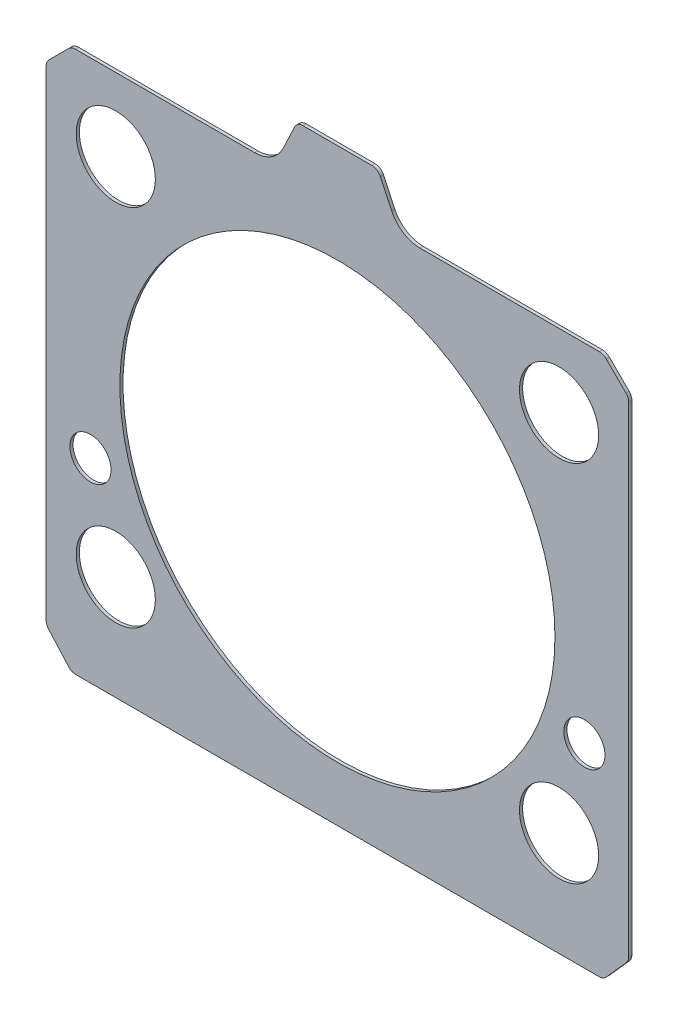
ISO-10303-21;
HEADER;
FILE_DESCRIPTION(('STEP AP214'),'2;1');
FILE_NAME('part.step','',(''),(''),'','','');
FILE_SCHEMA(('AUTOMOTIVE_DESIGN { 1 0 10303 214 1 1 1 1 }'));
ENDSEC;
DATA;
#1=APPLICATION_CONTEXT('core data for automotive mechanical design processes');
#2=APPLICATION_PROTOCOL_DEFINITION('international standard','automotive_design',2000,#1);
#3=PRODUCT_CONTEXT('',#1,'mechanical');
#4=PRODUCT('Part','Part','',(#3));
#5=PRODUCT_RELATED_PRODUCT_CATEGORY('part','',(#4));
#6=PRODUCT_DEFINITION_FORMATION('','',#4);
#7=PRODUCT_DEFINITION_CONTEXT('part definition',#1,'design');
#8=PRODUCT_DEFINITION('design','',#6,#7);
#9=PRODUCT_DEFINITION_SHAPE('','',#8);
#10=(LENGTH_UNIT() NAMED_UNIT(*) SI_UNIT(.MILLI.,.METRE.));
#11=(NAMED_UNIT(*) PLANE_ANGLE_UNIT() SI_UNIT($,.RADIAN.));
#12=(NAMED_UNIT(*) SI_UNIT($,.STERADIAN.) SOLID_ANGLE_UNIT());
#13=UNCERTAINTY_MEASURE_WITH_UNIT(LENGTH_MEASURE(1.E-05),#10,'distance_accuracy_value','');
#14=(GEOMETRIC_REPRESENTATION_CONTEXT(3) GLOBAL_UNCERTAINTY_ASSIGNED_CONTEXT((#13)) GLOBAL_UNIT_ASSIGNED_CONTEXT((#10,
#11,#12)) REPRESENTATION_CONTEXT('',''));
#15=CARTESIAN_POINT('',(0.,0.,0.));
#16=DIRECTION('',(0.,0.,1.));
#17=DIRECTION('',(1.,0.,0.));
#18=AXIS2_PLACEMENT_3D('',#15,#16,#17);
#19=CARTESIAN_POINT('',(92.,85.,1.));
#20=DIRECTION('',(0.,0.,1.));
#21=DIRECTION('',(1.,0.,0.));
#22=AXIS2_PLACEMENT_3D('',#19,#20,#21);
#23=PLANE('',#22);
#24=CARTESIAN_POINT('',(70.,-53.,1.));
#25=DIRECTION('',(0.,0.,1.));
#26=DIRECTION('',(1.,0.,0.));
#27=AXIS2_PLACEMENT_3D('',#24,#25,#26);
#28=CIRCLE('',#27,12.5);
#29=CARTESIAN_POINT('',(82.5,-53.,1.));
#30=VERTEX_POINT('',#29);
#31=EDGE_CURVE('E447',#30,#30,#28,.T.);
#32=ORIENTED_EDGE('',*,*,#31,.F.);
#33=EDGE_LOOP('',(#32));
#34=FACE_BOUND('',#33,.T.);
#35=CARTESIAN_POINT('',(70.,62.,1.));
#36=DIRECTION('',(0.,0.,1.));
#37=DIRECTION('',(1.,0.,0.));
#38=AXIS2_PLACEMENT_3D('',#35,#36,#37);
#39=CIRCLE('',#38,12.5);
#40=CARTESIAN_POINT('',(82.5,62.,1.));
#41=VERTEX_POINT('',#40);
#42=EDGE_CURVE('E435',#41,#41,#39,.T.);
#43=ORIENTED_EDGE('',*,*,#42,.F.);
#44=EDGE_LOOP('',(#43));
#45=FACE_BOUND('',#44,.T.);
#46=CARTESIAN_POINT('',(-78.,-24.5,1.));
#47=DIRECTION('',(0.,0.,1.));
#48=DIRECTION('',(-1.,0.,0.));
#49=AXIS2_PLACEMENT_3D('',#46,#47,#48);
#50=CIRCLE('',#49,6.5);
#51=CARTESIAN_POINT('',(-84.5,-24.5,1.));
#52=VERTEX_POINT('',#51);
#53=EDGE_CURVE('E423',#52,#52,#50,.T.);
#54=ORIENTED_EDGE('',*,*,#53,.F.);
#55=EDGE_LOOP('',(#54));
#56=FACE_BOUND('',#55,.T.);
#57=DIRECTION('',(0.66436383882992,-0.74740931868366,0.));
#58=VECTOR('',#57,1.);
#59=CARTESIAN_POINT('',(-92.,-77.,1.));
#60=LINE('',#59,#58);
#61=CARTESIAN_POINT('',(-91.242227956051,-77.8524935494427,1.));
#62=VERTEX_POINT('',#61);
#63=CARTESIAN_POINT('',(-84.8950297631203,-84.9930915164897,1.));
#64=VERTEX_POINT('',#63);
#65=EDGE_CURVE('E391',#62,#64,#60,.T.);
#66=ORIENTED_EDGE('',*,*,#65,.T.);
#67=CARTESIAN_POINT('',(-82.6528018070693,-83.,1.));
#68=DIRECTION('',(0.,0.,1.));
#69=DIRECTION('',(1.,0.,0.));
#70=AXIS2_PLACEMENT_3D('',#67,#68,#69);
#71=CIRCLE('',#70,3.);
#72=CARTESIAN_POINT('',(-82.6528018070693,-86.,1.));
#73=VERTEX_POINT('',#72);
#74=EDGE_CURVE('E320',#64,#73,#71,.T.);
#75=ORIENTED_EDGE('',*,*,#74,.T.);
#76=DIRECTION('',(1.,0.,0.));
#77=VECTOR('',#76,1.);
#78=CARTESIAN_POINT('',(-84.,-86.,1.));
#79=LINE('',#78,#77);
#80=CARTESIAN_POINT('',(82.6528018070693,-86.,1.));
#81=VERTEX_POINT('',#80);
#82=EDGE_CURVE('E393',#73,#81,#79,.T.);
#83=ORIENTED_EDGE('',*,*,#82,.T.);
#84=CARTESIAN_POINT('',(82.6528018070693,-83.,1.));
#85=DIRECTION('',(0.,0.,1.));
#86=DIRECTION('',(1.,0.,0.));
#87=AXIS2_PLACEMENT_3D('',#84,#85,#86);
#88=CIRCLE('',#87,3.);
#89=CARTESIAN_POINT('',(84.8950297631203,-84.9930915164897,1.));
#90=VERTEX_POINT('',#89);
#91=EDGE_CURVE('E63',#81,#90,#88,.T.);
#92=ORIENTED_EDGE('',*,*,#91,.T.);
#93=DIRECTION('',(0.66436383882992,0.74740931868366,0.));
#94=VECTOR('',#93,1.);
#95=CARTESIAN_POINT('',(92.,-77.,1.));
#96=LINE('',#95,#94);
#97=CARTESIAN_POINT('',(91.242227956051,-77.8524935494427,1.));
#98=VERTEX_POINT('',#97);
#99=EDGE_CURVE('E226',#90,#98,#96,.T.);
#100=ORIENTED_EDGE('',*,*,#99,.T.);
#101=CARTESIAN_POINT('',(89.,-75.8594020329529,1.));
#102=DIRECTION('',(0.,0.,1.));
#103=DIRECTION('',(1.,0.,0.));
#104=AXIS2_PLACEMENT_3D('',#101,#102,#103);
#105=CIRCLE('',#104,3.);
#106=CARTESIAN_POINT('',(92.,-75.8594020329529,1.));
#107=VERTEX_POINT('',#106);
#108=EDGE_CURVE('E315',#98,#107,#105,.T.);
#109=ORIENTED_EDGE('',*,*,#108,.T.);
#110=DIRECTION('',(0.,1.,0.));
#111=VECTOR('',#110,1.);
#112=CARTESIAN_POINT('',(92.,-77.,1.));
#113=LINE('',#112,#111);
#114=CARTESIAN_POINT('',(92.,75.7573593128807,1.));
#115=VERTEX_POINT('',#114);
#116=EDGE_CURVE('E260',#107,#115,#113,.T.);
#117=ORIENTED_EDGE('',*,*,#116,.T.);
#118=CARTESIAN_POINT('',(89.,75.7573593128807,1.));
#119=DIRECTION('',(0.,0.,1.));
#120=DIRECTION('',(1.,0.,0.));
#121=AXIS2_PLACEMENT_3D('',#118,#119,#120);
#122=CIRCLE('',#121,3.);
#123=CARTESIAN_POINT('',(91.1213203435597,77.8786796564404,1.));
#124=VERTEX_POINT('',#123);
#125=EDGE_CURVE('E313',#115,#124,#122,.T.);
#126=ORIENTED_EDGE('',*,*,#125,.T.);
#127=DIRECTION('',(-0.707106781186548,0.707106781186548,0.));
#128=VECTOR('',#127,1.);
#129=CARTESIAN_POINT('',(84.,85.,1.));
#130=LINE('',#129,#128);
#131=CARTESIAN_POINT('',(84.8786796564404,84.1213203435596,1.));
#132=VERTEX_POINT('',#131);
#133=EDGE_CURVE('E412',#124,#132,#130,.T.);
#134=ORIENTED_EDGE('',*,*,#133,.T.);
#135=CARTESIAN_POINT('',(82.7573593128808,82.,1.));
#136=DIRECTION('',(0.,0.,1.));
#137=DIRECTION('',(1.,0.,0.));
#138=AXIS2_PLACEMENT_3D('',#135,#136,#137);
#139=CIRCLE('',#138,3.);
#140=CARTESIAN_POINT('',(82.7573593128808,85.,1.));
#141=VERTEX_POINT('',#140);
#142=EDGE_CURVE('E311',#132,#141,#139,.T.);
#143=ORIENTED_EDGE('',*,*,#142,.T.);
#144=DIRECTION('',(-1.,0.,0.));
#145=VECTOR('',#144,1.);
#146=CARTESIAN_POINT('',(84.,85.,1.));
#147=LINE('',#146,#145);
#148=CARTESIAN_POINT('',(26.1494343746637,85.,1.));
#149=VERTEX_POINT('',#148);
#150=EDGE_CURVE('E362',#141,#149,#147,.T.);
#151=ORIENTED_EDGE('',*,*,#150,.T.);
#152=CARTESIAN_POINT('',(26.1494343746637,95.,1.));
#153=DIRECTION('',(0.,0.,1.));
#154=DIRECTION('',(1.,0.,0.));
#155=AXIS2_PLACEMENT_3D('',#152,#153,#154);
#156=CIRCLE('',#155,10.);
#157=CARTESIAN_POINT('',(17.0991973571654,90.7463886017758,1.));
#158=VERTEX_POINT('',#157);
#159=EDGE_CURVE('E215',#149,#158,#156,.F.);
#160=ORIENTED_EDGE('',*,*,#159,.T.);
#161=DIRECTION('',(-0.425361139822422,0.905023701749833,0.));
#162=VECTOR('',#161,1.);
#163=CARTESIAN_POINT('',(19.8,85.,1.));
#164=LINE('',#163,#162);
#165=CARTESIAN_POINT('',(13.5602407928504,98.2760834194673,1.));
#166=VERTEX_POINT('',#165);
#167=EDGE_CURVE('E225',#158,#166,#164,.T.);
#168=ORIENTED_EDGE('',*,*,#167,.T.);
#169=CARTESIAN_POINT('',(10.8451696876009,97.,1.));
#170=DIRECTION('',(0.,0.,1.));
#171=DIRECTION('',(1.,0.,0.));
#172=AXIS2_PLACEMENT_3D('',#169,#170,#171);
#173=CIRCLE('',#172,3.);
#174=CARTESIAN_POINT('',(10.8451696876009,100.,1.));
#175=VERTEX_POINT('',#174);
#176=EDGE_CURVE('E305',#166,#175,#173,.T.);
#177=ORIENTED_EDGE('',*,*,#176,.T.);
#178=DIRECTION('',(-1.,0.,0.));
#179=VECTOR('',#178,1.);
#180=CARTESIAN_POINT('',(12.75,100.,1.));
#181=LINE('',#180,#179);
#182=CARTESIAN_POINT('',(-10.8451696876009,100.,1.));
#183=VERTEX_POINT('',#182);
#184=EDGE_CURVE('E361',#175,#183,#181,.T.);
#185=ORIENTED_EDGE('',*,*,#184,.T.);
#186=CARTESIAN_POINT('',(-10.8451696876009,97.,1.));
#187=DIRECTION('',(0.,0.,1.));
#188=DIRECTION('',(1.,0.,0.));
#189=AXIS2_PLACEMENT_3D('',#186,#187,#188);
#190=CIRCLE('',#189,3.);
#191=CARTESIAN_POINT('',(-13.5602407928504,98.2760834194673,1.));
#192=VERTEX_POINT('',#191);
#193=EDGE_CURVE('E303',#183,#192,#190,.T.);
#194=ORIENTED_EDGE('',*,*,#193,.T.);
#195=DIRECTION('',(-0.425361139822422,-0.905023701749833,0.));
#196=VECTOR('',#195,1.);
#197=CARTESIAN_POINT('',(-12.75,100.,1.));
#198=LINE('',#197,#196);
#199=CARTESIAN_POINT('',(-17.0991973571654,90.7463886017758,1.));
#200=VERTEX_POINT('',#199);
#201=EDGE_CURVE('E376',#192,#200,#198,.T.);
#202=ORIENTED_EDGE('',*,*,#201,.T.);
#203=CARTESIAN_POINT('',(-26.1494343746637,95.,1.));
#204=DIRECTION('',(0.,0.,1.));
#205=DIRECTION('',(1.,0.,0.));
#206=AXIS2_PLACEMENT_3D('',#203,#204,#205);
#207=CIRCLE('',#206,10.);
#208=CARTESIAN_POINT('',(-26.1494343746637,85.,1.));
#209=VERTEX_POINT('',#208);
#210=EDGE_CURVE('E272',#200,#209,#207,.F.);
#211=ORIENTED_EDGE('',*,*,#210,.T.);
#212=DIRECTION('',(-1.,0.,0.));
#213=VECTOR('',#212,1.);
#214=CARTESIAN_POINT('',(-19.8,85.,1.));
#215=LINE('',#214,#213);
#216=CARTESIAN_POINT('',(-82.7573593128808,85.,1.));
#217=VERTEX_POINT('',#216);
#218=EDGE_CURVE('E379',#209,#217,#215,.T.);
#219=ORIENTED_EDGE('',*,*,#218,.T.);
#220=CARTESIAN_POINT('',(-82.7573593128808,82.,1.));
#221=DIRECTION('',(0.,0.,1.));
#222=DIRECTION('',(1.,0.,0.));
#223=AXIS2_PLACEMENT_3D('',#220,#221,#222);
#224=CIRCLE('',#223,3.);
#225=CARTESIAN_POINT('',(-84.8786796564404,84.1213203435596,1.));
#226=VERTEX_POINT('',#225);
#227=EDGE_CURVE('E309',#217,#226,#224,.T.);
#228=ORIENTED_EDGE('',*,*,#227,.T.);
#229=DIRECTION('',(-0.707106781186548,-0.707106781186548,0.));
#230=VECTOR('',#229,1.);
#231=CARTESIAN_POINT('',(-84.,85.,1.));
#232=LINE('',#231,#230);
#233=CARTESIAN_POINT('',(-91.1213203435597,77.8786796564404,1.));
#234=VERTEX_POINT('',#233);
#235=EDGE_CURVE('E382',#226,#234,#232,.T.);
#236=ORIENTED_EDGE('',*,*,#235,.T.);
#237=CARTESIAN_POINT('',(-89.,75.7573593128807,1.));
#238=DIRECTION('',(0.,0.,1.));
#239=DIRECTION('',(1.,0.,0.));
#240=AXIS2_PLACEMENT_3D('',#237,#238,#239);
#241=CIRCLE('',#240,3.);
#242=CARTESIAN_POINT('',(-92.,75.7573593128807,1.));
#243=VERTEX_POINT('',#242);
#244=EDGE_CURVE('E307',#234,#243,#241,.T.);
#245=ORIENTED_EDGE('',*,*,#244,.T.);
#246=DIRECTION('',(0.,-1.,0.));
#247=VECTOR('',#246,1.);
#248=CARTESIAN_POINT('',(-92.,77.,1.));
#249=LINE('',#248,#247);
#250=CARTESIAN_POINT('',(-92.,-75.8594020329529,1.));
#251=VERTEX_POINT('',#250);
#252=EDGE_CURVE('E388',#243,#251,#249,.T.);
#253=ORIENTED_EDGE('',*,*,#252,.T.);
#254=CARTESIAN_POINT('',(-89.,-75.8594020329529,1.));
#255=DIRECTION('',(0.,0.,1.));
#256=DIRECTION('',(1.,0.,0.));
#257=AXIS2_PLACEMENT_3D('',#254,#255,#256);
#258=CIRCLE('',#257,3.);
#259=EDGE_CURVE('E318',#251,#62,#258,.T.);
#260=ORIENTED_EDGE('',*,*,#259,.T.);
#261=EDGE_LOOP('',(#66,#75,#83,#92,#100,#109,#117,#126,#134,#143,#151,#160,#168,#177,#185,#194,
#202,#211,#219,#228,#236,#245,#253,#260));
#262=FACE_BOUND('',#261,.T.);
#263=CARTESIAN_POINT('',(0.,0.,1.));
#264=DIRECTION('',(0.,0.,1.));
#265=DIRECTION('',(1.,0.,0.));
#266=AXIS2_PLACEMENT_3D('',#263,#264,#265);
#267=CIRCLE('',#266,68.7);
#268=CARTESIAN_POINT('',(68.7,0.,1.));
#269=VERTEX_POINT('',#268);
#270=EDGE_CURVE('E398',#269,#269,#267,.T.);
#271=ORIENTED_EDGE('',*,*,#270,.F.);
#272=EDGE_LOOP('',(#271));
#273=FACE_BOUND('',#272,.T.);
#274=CARTESIAN_POINT('',(-70.,62.,1.));
#275=DIRECTION('',(0.,0.,1.));
#276=DIRECTION('',(1.,0.,0.));
#277=AXIS2_PLACEMENT_3D('',#274,#275,#276);
#278=CIRCLE('',#277,12.5);
#279=CARTESIAN_POINT('',(-57.5,62.,1.));
#280=VERTEX_POINT('',#279);
#281=EDGE_CURVE('E429',#280,#280,#278,.T.);
#282=ORIENTED_EDGE('',*,*,#281,.F.);
#283=EDGE_LOOP('',(#282));
#284=FACE_BOUND('',#283,.T.);
#285=CARTESIAN_POINT('',(-70.,-53.,1.));
#286=DIRECTION('',(0.,0.,1.));
#287=DIRECTION('',(1.,0.,0.));
#288=AXIS2_PLACEMENT_3D('',#285,#286,#287);
#289=CIRCLE('',#288,12.5);
#290=CARTESIAN_POINT('',(-57.5,-53.,1.));
#291=VERTEX_POINT('',#290);
#292=EDGE_CURVE('E441',#291,#291,#289,.T.);
#293=ORIENTED_EDGE('',*,*,#292,.F.);
#294=EDGE_LOOP('',(#293));
#295=FACE_BOUND('',#294,.T.);
#296=CARTESIAN_POINT('',(78.,-24.5,1.));
#297=DIRECTION('',(0.,0.,1.));
#298=DIRECTION('',(1.,0.,0.));
#299=AXIS2_PLACEMENT_3D('',#296,#297,#298);
#300=CIRCLE('',#299,6.5);
#301=CARTESIAN_POINT('',(84.5,-24.5,1.));
#302=VERTEX_POINT('',#301);
#303=EDGE_CURVE('E453',#302,#302,#300,.T.);
#304=ORIENTED_EDGE('',*,*,#303,.F.);
#305=EDGE_LOOP('',(#304));
#306=FACE_BOUND('',#305,.T.);
#307=ADVANCED_FACE('F41',(#34,#45,#56,#262,#273,#284,#295,#306),#23,.T.);
#308=CARTESIAN_POINT('',(92.,85.,0.));
#309=DIRECTION('',(0.,0.,1.));
#310=DIRECTION('',(1.,0.,0.));
#311=AXIS2_PLACEMENT_3D('',#308,#309,#310);
#312=PLANE('',#311);
#313=DIRECTION('',(1.,0.,0.));
#314=VECTOR('',#313,1.);
#315=CARTESIAN_POINT('',(-84.,-86.,0.));
#316=LINE('',#315,#314);
#317=CARTESIAN_POINT('',(-82.6528018070693,-86.,0.));
#318=VERTEX_POINT('',#317);
#319=CARTESIAN_POINT('',(82.6528018070693,-86.,0.));
#320=VERTEX_POINT('',#319);
#321=EDGE_CURVE('E256',#318,#320,#316,.T.);
#322=ORIENTED_EDGE('',*,*,#321,.F.);
#323=CARTESIAN_POINT('',(-82.6528018070693,-83.,0.));
#324=DIRECTION('',(0.,0.,1.));
#325=DIRECTION('',(1.,0.,0.));
#326=AXIS2_PLACEMENT_3D('',#323,#324,#325);
#327=CIRCLE('',#326,3.);
#328=CARTESIAN_POINT('',(-84.8950297631203,-84.9930915164897,0.));
#329=VERTEX_POINT('',#328);
#330=EDGE_CURVE('E296',#318,#329,#327,.F.);
#331=ORIENTED_EDGE('',*,*,#330,.T.);
#332=DIRECTION('',(0.66436383882992,-0.74740931868366,0.));
#333=VECTOR('',#332,1.);
#334=CARTESIAN_POINT('',(-92.,-77.,0.));
#335=LINE('',#334,#333);
#336=CARTESIAN_POINT('',(-91.242227956051,-77.8524935494427,0.));
#337=VERTEX_POINT('',#336);
#338=EDGE_CURVE('E253',#337,#329,#335,.T.);
#339=ORIENTED_EDGE('',*,*,#338,.F.);
#340=CARTESIAN_POINT('',(-89.,-75.8594020329529,0.));
#341=DIRECTION('',(0.,0.,1.));
#342=DIRECTION('',(1.,0.,0.));
#343=AXIS2_PLACEMENT_3D('',#340,#341,#342);
#344=CIRCLE('',#343,3.);
#345=CARTESIAN_POINT('',(-92.,-75.8594020329529,0.));
#346=VERTEX_POINT('',#345);
#347=EDGE_CURVE('E294',#337,#346,#344,.F.);
#348=ORIENTED_EDGE('',*,*,#347,.T.);
#349=DIRECTION('',(0.,-1.,0.));
#350=VECTOR('',#349,1.);
#351=CARTESIAN_POINT('',(-92.,77.,0.));
#352=LINE('',#351,#350);
#353=CARTESIAN_POINT('',(-92.,75.7573593128807,0.));
#354=VERTEX_POINT('',#353);
#355=EDGE_CURVE('E250',#354,#346,#352,.T.);
#356=ORIENTED_EDGE('',*,*,#355,.F.);
#357=CARTESIAN_POINT('',(-89.,75.7573593128807,0.));
#358=DIRECTION('',(0.,0.,1.));
#359=DIRECTION('',(1.,0.,0.));
#360=AXIS2_PLACEMENT_3D('',#357,#358,#359);
#361=CIRCLE('',#360,3.);
#362=CARTESIAN_POINT('',(-91.1213203435597,77.8786796564404,0.));
#363=VERTEX_POINT('',#362);
#364=EDGE_CURVE('E282',#354,#363,#361,.F.);
#365=ORIENTED_EDGE('',*,*,#364,.T.);
#366=DIRECTION('',(-0.707106781186548,-0.707106781186548,0.));
#367=VECTOR('',#366,1.);
#368=CARTESIAN_POINT('',(-84.,85.,0.));
#369=LINE('',#368,#367);
#370=CARTESIAN_POINT('',(-84.8786796564404,84.1213203435596,0.));
#371=VERTEX_POINT('',#370);
#372=EDGE_CURVE('E247',#371,#363,#369,.T.);
#373=ORIENTED_EDGE('',*,*,#372,.F.);
#374=CARTESIAN_POINT('',(-82.7573593128808,82.,0.));
#375=DIRECTION('',(0.,0.,1.));
#376=DIRECTION('',(1.,0.,0.));
#377=AXIS2_PLACEMENT_3D('',#374,#375,#376);
#378=CIRCLE('',#377,3.);
#379=CARTESIAN_POINT('',(-82.7573593128808,85.,0.));
#380=VERTEX_POINT('',#379);
#381=EDGE_CURVE('E284',#371,#380,#378,.F.);
#382=ORIENTED_EDGE('',*,*,#381,.T.);
#383=DIRECTION('',(-1.,0.,0.));
#384=VECTOR('',#383,1.);
#385=CARTESIAN_POINT('',(-19.8,85.,0.));
#386=LINE('',#385,#384);
#387=CARTESIAN_POINT('',(-26.1494343746637,85.,0.));
#388=VERTEX_POINT('',#387);
#389=EDGE_CURVE('E244',#388,#380,#386,.T.);
#390=ORIENTED_EDGE('',*,*,#389,.F.);
#391=CARTESIAN_POINT('',(-26.1494343746637,95.,0.));
#392=DIRECTION('',(0.,0.,1.));
#393=DIRECTION('',(1.,0.,0.));
#394=AXIS2_PLACEMENT_3D('',#391,#392,#393);
#395=CIRCLE('',#394,10.);
#396=CARTESIAN_POINT('',(-17.0991973571654,90.7463886017758,0.));
#397=VERTEX_POINT('',#396);
#398=EDGE_CURVE('E269',#388,#397,#395,.T.);
#399=ORIENTED_EDGE('',*,*,#398,.T.);
#400=DIRECTION('',(-0.425361139822422,-0.905023701749833,0.));
#401=VECTOR('',#400,1.);
#402=CARTESIAN_POINT('',(-12.75,100.,0.));
#403=LINE('',#402,#401);
#404=CARTESIAN_POINT('',(-13.5602407928504,98.2760834194673,0.));
#405=VERTEX_POINT('',#404);
#406=EDGE_CURVE('E237',#405,#397,#403,.T.);
#407=ORIENTED_EDGE('',*,*,#406,.F.);
#408=CARTESIAN_POINT('',(-10.8451696876009,97.,0.));
#409=DIRECTION('',(0.,0.,1.));
#410=DIRECTION('',(1.,0.,0.));
#411=AXIS2_PLACEMENT_3D('',#408,#409,#410);
#412=CIRCLE('',#411,3.);
#413=CARTESIAN_POINT('',(-10.8451696876009,100.,0.));
#414=VERTEX_POINT('',#413);
#415=EDGE_CURVE('E279',#405,#414,#412,.F.);
#416=ORIENTED_EDGE('',*,*,#415,.T.);
#417=DIRECTION('',(-1.,0.,0.));
#418=VECTOR('',#417,1.);
#419=CARTESIAN_POINT('',(12.75,100.,0.));
#420=LINE('',#419,#418);
#421=CARTESIAN_POINT('',(10.8451696876009,100.,0.));
#422=VERTEX_POINT('',#421);
#423=EDGE_CURVE('E233',#422,#414,#420,.T.);
#424=ORIENTED_EDGE('',*,*,#423,.F.);
#425=CARTESIAN_POINT('',(10.8451696876009,97.,0.));
#426=DIRECTION('',(0.,0.,1.));
#427=DIRECTION('',(1.,0.,0.));
#428=AXIS2_PLACEMENT_3D('',#425,#426,#427);
#429=CIRCLE('',#428,3.);
#430=CARTESIAN_POINT('',(13.5602407928504,98.2760834194673,0.));
#431=VERTEX_POINT('',#430);
#432=EDGE_CURVE('E232',#422,#431,#429,.F.);
#433=ORIENTED_EDGE('',*,*,#432,.T.);
#434=DIRECTION('',(-0.425361139822422,0.905023701749833,0.));
#435=VECTOR('',#434,1.);
#436=CARTESIAN_POINT('',(19.8,85.,0.));
#437=LINE('',#436,#435);
#438=CARTESIAN_POINT('',(17.0991973571654,90.7463886017758,0.));
#439=VERTEX_POINT('',#438);
#440=EDGE_CURVE('E222',#439,#431,#437,.T.);
#441=ORIENTED_EDGE('',*,*,#440,.F.);
#442=CARTESIAN_POINT('',(26.1494343746637,95.,0.));
#443=DIRECTION('',(0.,0.,1.));
#444=DIRECTION('',(1.,0.,0.));
#445=AXIS2_PLACEMENT_3D('',#442,#443,#444);
#446=CIRCLE('',#445,10.);
#447=CARTESIAN_POINT('',(26.1494343746637,85.,0.));
#448=VERTEX_POINT('',#447);
#449=EDGE_CURVE('E205',#439,#448,#446,.T.);
#450=ORIENTED_EDGE('',*,*,#449,.T.);
#451=DIRECTION('',(-1.,0.,0.));
#452=VECTOR('',#451,1.);
#453=CARTESIAN_POINT('',(84.,85.,0.));
#454=LINE('',#453,#452);
#455=CARTESIAN_POINT('',(82.7573593128808,85.,0.));
#456=VERTEX_POINT('',#455);
#457=EDGE_CURVE('E234',#456,#448,#454,.T.);
#458=ORIENTED_EDGE('',*,*,#457,.F.);
#459=CARTESIAN_POINT('',(82.7573593128808,82.,0.));
#460=DIRECTION('',(0.,0.,1.));
#461=DIRECTION('',(1.,0.,0.));
#462=AXIS2_PLACEMENT_3D('',#459,#460,#461);
#463=CIRCLE('',#462,3.);
#464=CARTESIAN_POINT('',(84.8786796564404,84.1213203435596,0.));
#465=VERTEX_POINT('',#464);
#466=EDGE_CURVE('E286',#456,#465,#463,.F.);
#467=ORIENTED_EDGE('',*,*,#466,.T.);
#468=DIRECTION('',(-0.707106781186548,0.707106781186548,0.));
#469=VECTOR('',#468,1.);
#470=CARTESIAN_POINT('',(84.,85.,0.));
#471=LINE('',#470,#469);
#472=CARTESIAN_POINT('',(91.1213203435597,77.8786796564404,0.));
#473=VERTEX_POINT('',#472);
#474=EDGE_CURVE('E239',#473,#465,#471,.T.);
#475=ORIENTED_EDGE('',*,*,#474,.F.);
#476=CARTESIAN_POINT('',(89.,75.7573593128807,0.));
#477=DIRECTION('',(0.,0.,1.));
#478=DIRECTION('',(1.,0.,0.));
#479=AXIS2_PLACEMENT_3D('',#476,#477,#478);
#480=CIRCLE('',#479,3.);
#481=CARTESIAN_POINT('',(92.,75.7573593128807,0.));
#482=VERTEX_POINT('',#481);
#483=EDGE_CURVE('E288',#473,#482,#480,.F.);
#484=ORIENTED_EDGE('',*,*,#483,.T.);
#485=DIRECTION('',(0.,1.,0.));
#486=VECTOR('',#485,1.);
#487=CARTESIAN_POINT('',(92.,-77.,0.));
#488=LINE('',#487,#486);
#489=CARTESIAN_POINT('',(92.,-75.8594020329529,0.));
#490=VERTEX_POINT('',#489);
#491=EDGE_CURVE('E396',#490,#482,#488,.T.);
#492=ORIENTED_EDGE('',*,*,#491,.F.);
#493=CARTESIAN_POINT('',(89.,-75.8594020329529,0.));
#494=DIRECTION('',(0.,0.,1.));
#495=DIRECTION('',(1.,0.,0.));
#496=AXIS2_PLACEMENT_3D('',#493,#494,#495);
#497=CIRCLE('',#496,3.);
#498=CARTESIAN_POINT('',(91.242227956051,-77.8524935494427,0.));
#499=VERTEX_POINT('',#498);
#500=EDGE_CURVE('E290',#490,#499,#497,.F.);
#501=ORIENTED_EDGE('',*,*,#500,.T.);
#502=DIRECTION('',(0.66436383882992,0.74740931868366,0.));
#503=VECTOR('',#502,1.);
#504=CARTESIAN_POINT('',(92.,-77.,0.));
#505=LINE('',#504,#503);
#506=CARTESIAN_POINT('',(84.8950297631203,-84.9930915164897,0.));
#507=VERTEX_POINT('',#506);
#508=EDGE_CURVE('E259',#507,#499,#505,.T.);
#509=ORIENTED_EDGE('',*,*,#508,.F.);
#510=CARTESIAN_POINT('',(82.6528018070693,-83.,0.));
#511=DIRECTION('',(0.,0.,1.));
#512=DIRECTION('',(1.,0.,0.));
#513=AXIS2_PLACEMENT_3D('',#510,#511,#512);
#514=CIRCLE('',#513,3.);
#515=EDGE_CURVE('E292',#507,#320,#514,.F.);
#516=ORIENTED_EDGE('',*,*,#515,.T.);
#517=EDGE_LOOP('',(#322,#331,#339,#348,#356,#365,#373,#382,#390,#399,#407,#416,#424,#433,#441,
#450,#458,#467,#475,#484,#492,#501,#509,#516));
#518=FACE_BOUND('',#517,.T.);
#519=CARTESIAN_POINT('',(0.,0.,0.));
#520=DIRECTION('',(0.,0.,1.));
#521=DIRECTION('',(1.,0.,0.));
#522=AXIS2_PLACEMENT_3D('',#519,#520,#521);
#523=CIRCLE('',#522,68.7);
#524=CARTESIAN_POINT('',(68.7,0.,0.));
#525=VERTEX_POINT('',#524);
#526=EDGE_CURVE('E420',#525,#525,#523,.T.);
#527=ORIENTED_EDGE('',*,*,#526,.T.);
#528=EDGE_LOOP('',(#527));
#529=FACE_BOUND('',#528,.T.);
#530=CARTESIAN_POINT('',(-78.,-24.5,0.));
#531=DIRECTION('',(0.,0.,1.));
#532=DIRECTION('',(-1.,0.,0.));
#533=AXIS2_PLACEMENT_3D('',#530,#531,#532);
#534=CIRCLE('',#533,6.5);
#535=CARTESIAN_POINT('',(-84.5,-24.5,0.));
#536=VERTEX_POINT('',#535);
#537=EDGE_CURVE('E426',#536,#536,#534,.T.);
#538=ORIENTED_EDGE('',*,*,#537,.T.);
#539=EDGE_LOOP('',(#538));
#540=FACE_BOUND('',#539,.T.);
#541=CARTESIAN_POINT('',(-70.,62.,0.));
#542=DIRECTION('',(0.,0.,1.));
#543=DIRECTION('',(1.,0.,0.));
#544=AXIS2_PLACEMENT_3D('',#541,#542,#543);
#545=CIRCLE('',#544,12.5);
#546=CARTESIAN_POINT('',(-57.5,62.,0.));
#547=VERTEX_POINT('',#546);
#548=EDGE_CURVE('E432',#547,#547,#545,.T.);
#549=ORIENTED_EDGE('',*,*,#548,.T.);
#550=EDGE_LOOP('',(#549));
#551=FACE_BOUND('',#550,.T.);
#552=CARTESIAN_POINT('',(70.,62.,0.));
#553=DIRECTION('',(0.,0.,1.));
#554=DIRECTION('',(1.,0.,0.));
#555=AXIS2_PLACEMENT_3D('',#552,#553,#554);
#556=CIRCLE('',#555,12.5);
#557=CARTESIAN_POINT('',(82.5,62.,0.));
#558=VERTEX_POINT('',#557);
#559=EDGE_CURVE('E438',#558,#558,#556,.T.);
#560=ORIENTED_EDGE('',*,*,#559,.T.);
#561=EDGE_LOOP('',(#560));
#562=FACE_BOUND('',#561,.T.);
#563=CARTESIAN_POINT('',(-70.,-53.,0.));
#564=DIRECTION('',(0.,0.,1.));
#565=DIRECTION('',(1.,0.,0.));
#566=AXIS2_PLACEMENT_3D('',#563,#564,#565);
#567=CIRCLE('',#566,12.5);
#568=CARTESIAN_POINT('',(-57.5,-53.,0.));
#569=VERTEX_POINT('',#568);
#570=EDGE_CURVE('E444',#569,#569,#567,.T.);
#571=ORIENTED_EDGE('',*,*,#570,.T.);
#572=EDGE_LOOP('',(#571));
#573=FACE_BOUND('',#572,.T.);
#574=CARTESIAN_POINT('',(70.,-53.,0.));
#575=DIRECTION('',(0.,0.,1.));
#576=DIRECTION('',(1.,0.,0.));
#577=AXIS2_PLACEMENT_3D('',#574,#575,#576);
#578=CIRCLE('',#577,12.5);
#579=CARTESIAN_POINT('',(82.5,-53.,0.));
#580=VERTEX_POINT('',#579);
#581=EDGE_CURVE('E450',#580,#580,#578,.T.);
#582=ORIENTED_EDGE('',*,*,#581,.T.);
#583=EDGE_LOOP('',(#582));
#584=FACE_BOUND('',#583,.T.);
#585=CARTESIAN_POINT('',(78.,-24.5,0.));
#586=DIRECTION('',(0.,0.,1.));
#587=DIRECTION('',(1.,0.,0.));
#588=AXIS2_PLACEMENT_3D('',#585,#586,#587);
#589=CIRCLE('',#588,6.5);
#590=CARTESIAN_POINT('',(84.5,-24.5,0.));
#591=VERTEX_POINT('',#590);
#592=EDGE_CURVE('E456',#591,#591,#589,.T.);
#593=ORIENTED_EDGE('',*,*,#592,.T.);
#594=EDGE_LOOP('',(#593));
#595=FACE_BOUND('',#594,.T.);
#596=ADVANCED_FACE('F229',(#518,#529,#540,#551,#562,#573,#584,#595),#312,.F.);
#597=CARTESIAN_POINT('',(92.,-77.,1.));
#598=DIRECTION('',(-1.,0.,0.));
#599=DIRECTION('',(0.,-1.,0.));
#600=AXIS2_PLACEMENT_3D('',#597,#598,#599);
#601=PLANE('',#600);
#602=ORIENTED_EDGE('',*,*,#116,.F.);
#603=DIRECTION('',(0.,0.,-1.));
#604=VECTOR('',#603,1.);
#605=CARTESIAN_POINT('',(92.,-75.8594020329529,1.));
#606=LINE('',#605,#604);
#607=EDGE_CURVE('E333',#107,#490,#606,.T.);
#608=ORIENTED_EDGE('',*,*,#607,.T.);
#609=ORIENTED_EDGE('',*,*,#491,.T.);
#610=DIRECTION('',(0.,0.,-1.));
#611=VECTOR('',#610,1.);
#612=CARTESIAN_POINT('',(92.,75.7573593128807,1.));
#613=LINE('',#612,#611);
#614=EDGE_CURVE('E331',#482,#115,#613,.F.);
#615=ORIENTED_EDGE('',*,*,#614,.T.);
#616=EDGE_LOOP('',(#602,#608,#609,#615));
#617=FACE_BOUND('',#616,.T.);
#618=ADVANCED_FACE('F472',(#617),#601,.F.);
#619=CARTESIAN_POINT('',(84.,85.,1.));
#620=DIRECTION('',(-0.707106781186548,-0.707106781186548,0.));
#621=DIRECTION('',(0.707106781186548,-0.707106781186548,0.));
#622=AXIS2_PLACEMENT_3D('',#619,#620,#621);
#623=PLANE('',#622);
#624=ORIENTED_EDGE('',*,*,#133,.F.);
#625=DIRECTION('',(0.,0.,-1.));
#626=VECTOR('',#625,1.);
#627=CARTESIAN_POINT('',(91.1213203435597,77.8786796564404,1.));
#628=LINE('',#627,#626);
#629=EDGE_CURVE('E338',#124,#473,#628,.T.);
#630=ORIENTED_EDGE('',*,*,#629,.T.);
#631=ORIENTED_EDGE('',*,*,#474,.T.);
#632=DIRECTION('',(0.,0.,-1.));
#633=VECTOR('',#632,1.);
#634=CARTESIAN_POINT('',(84.8786796564404,84.1213203435596,1.));
#635=LINE('',#634,#633);
#636=EDGE_CURVE('E336',#465,#132,#635,.F.);
#637=ORIENTED_EDGE('',*,*,#636,.T.);
#638=EDGE_LOOP('',(#624,#630,#631,#637));
#639=FACE_BOUND('',#638,.T.);
#640=ADVANCED_FACE('F404',(#639),#623,.F.);
#641=CARTESIAN_POINT('',(84.,85.,1.));
#642=DIRECTION('',(0.,-1.,0.));
#643=DIRECTION('',(1.,0.,0.));
#644=AXIS2_PLACEMENT_3D('',#641,#642,#643);
#645=PLANE('',#644);
#646=ORIENTED_EDGE('',*,*,#150,.F.);
#647=DIRECTION('',(0.,0.,-1.));
#648=VECTOR('',#647,1.);
#649=CARTESIAN_POINT('',(82.7573593128808,85.,1.));
#650=LINE('',#649,#648);
#651=EDGE_CURVE('E341',#141,#456,#650,.T.);
#652=ORIENTED_EDGE('',*,*,#651,.T.);
#653=ORIENTED_EDGE('',*,*,#457,.T.);
#654=DIRECTION('',(0.,0.,-1.));
#655=VECTOR('',#654,1.);
#656=CARTESIAN_POINT('',(26.1494343746637,85.,1.));
#657=LINE('',#656,#655);
#658=EDGE_CURVE('E211',#448,#149,#657,.F.);
#659=ORIENTED_EDGE('',*,*,#658,.T.);
#660=EDGE_LOOP('',(#646,#652,#653,#659));
#661=FACE_BOUND('',#660,.T.);
#662=ADVANCED_FACE('F414',(#661),#645,.F.);
#663=CARTESIAN_POINT('',(19.8,85.,1.));
#664=DIRECTION('',(-0.905023701749833,-0.425361139822422,0.));
#665=DIRECTION('',(0.425361139822422,-0.905023701749833,0.));
#666=AXIS2_PLACEMENT_3D('',#663,#664,#665);
#667=PLANE('',#666);
#668=ORIENTED_EDGE('',*,*,#440,.T.);
#669=DIRECTION('',(0.,0.,-1.));
#670=VECTOR('',#669,1.);
#671=CARTESIAN_POINT('',(13.5602407928504,98.2760834194673,1.));
#672=LINE('',#671,#670);
#673=EDGE_CURVE('E49',#431,#166,#672,.F.);
#674=ORIENTED_EDGE('',*,*,#673,.T.);
#675=ORIENTED_EDGE('',*,*,#167,.F.);
#676=DIRECTION('',(0.,0.,-1.));
#677=VECTOR('',#676,1.);
#678=CARTESIAN_POINT('',(17.0991973571654,90.7463886017758,0.));
#679=LINE('',#678,#677);
#680=EDGE_CURVE('E209',#158,#439,#679,.T.);
#681=ORIENTED_EDGE('',*,*,#680,.T.);
#682=EDGE_LOOP('',(#668,#674,#675,#681));
#683=FACE_BOUND('',#682,.T.);
#684=ADVANCED_FACE('F221',(#683),#667,.F.);
#685=CARTESIAN_POINT('',(12.75,100.,1.));
#686=DIRECTION('',(0.,-1.,0.));
#687=DIRECTION('',(0.,0.,-1.));
#688=AXIS2_PLACEMENT_3D('',#685,#686,#687);
#689=PLANE('',#688);
#690=ORIENTED_EDGE('',*,*,#184,.F.);
#691=DIRECTION('',(0.,0.,-1.));
#692=VECTOR('',#691,1.);
#693=CARTESIAN_POINT('',(10.8451696876009,100.,1.));
#694=LINE('',#693,#692);
#695=EDGE_CURVE('E353',#175,#422,#694,.T.);
#696=ORIENTED_EDGE('',*,*,#695,.T.);
#697=ORIENTED_EDGE('',*,*,#423,.T.);
#698=DIRECTION('',(0.,0.,-1.));
#699=VECTOR('',#698,1.);
#700=CARTESIAN_POINT('',(-10.8451696876009,100.,1.));
#701=LINE('',#700,#699);
#702=EDGE_CURVE('E351',#414,#183,#701,.F.);
#703=ORIENTED_EDGE('',*,*,#702,.T.);
#704=EDGE_LOOP('',(#690,#696,#697,#703));
#705=FACE_BOUND('',#704,.T.);
#706=ADVANCED_FACE('F367',(#705),#689,.F.);
#707=CARTESIAN_POINT('',(-12.75,100.,1.));
#708=DIRECTION('',(0.905023701749833,-0.425361139822422,0.));
#709=DIRECTION('',(0.425361139822422,0.905023701749833,0.));
#710=AXIS2_PLACEMENT_3D('',#707,#708,#709);
#711=PLANE('',#710);
#712=ORIENTED_EDGE('',*,*,#201,.F.);
#713=DIRECTION('',(0.,0.,-1.));
#714=VECTOR('',#713,1.);
#715=CARTESIAN_POINT('',(-13.5602407928504,98.2760834194673,1.));
#716=LINE('',#715,#714);
#717=EDGE_CURVE('E11',#192,#405,#716,.T.);
#718=ORIENTED_EDGE('',*,*,#717,.T.);
#719=ORIENTED_EDGE('',*,*,#406,.T.);
#720=DIRECTION('',(0.,0.,-1.));
#721=VECTOR('',#720,1.);
#722=CARTESIAN_POINT('',(-17.0991973571654,90.7463886017758,1.));
#723=LINE('',#722,#721);
#724=EDGE_CURVE('E216',#397,#200,#723,.F.);
#725=ORIENTED_EDGE('',*,*,#724,.T.);
#726=EDGE_LOOP('',(#712,#718,#719,#725));
#727=FACE_BOUND('',#726,.T.);
#728=ADVANCED_FACE('F375',(#727),#711,.F.);
#729=CARTESIAN_POINT('',(-19.8,85.,1.));
#730=DIRECTION('',(0.,-1.,0.));
#731=DIRECTION('',(1.,0.,0.));
#732=AXIS2_PLACEMENT_3D('',#729,#730,#731);
#733=PLANE('',#732);
#734=ORIENTED_EDGE('',*,*,#389,.T.);
#735=DIRECTION('',(0.,0.,-1.));
#736=VECTOR('',#735,1.);
#737=CARTESIAN_POINT('',(-82.7573593128808,85.,1.));
#738=LINE('',#737,#736);
#739=EDGE_CURVE('E349',#380,#217,#738,.F.);
#740=ORIENTED_EDGE('',*,*,#739,.T.);
#741=ORIENTED_EDGE('',*,*,#218,.F.);
#742=DIRECTION('',(0.,0.,-1.));
#743=VECTOR('',#742,1.);
#744=CARTESIAN_POINT('',(-26.1494343746637,85.,0.));
#745=LINE('',#744,#743);
#746=EDGE_CURVE('E263',#209,#388,#745,.T.);
#747=ORIENTED_EDGE('',*,*,#746,.T.);
#748=EDGE_LOOP('',(#734,#740,#741,#747));
#749=FACE_BOUND('',#748,.T.);
#750=ADVANCED_FACE('F498',(#749),#733,.F.);
#751=CARTESIAN_POINT('',(-84.,85.,1.));
#752=DIRECTION('',(0.707106781186548,-0.707106781186548,0.));
#753=DIRECTION('',(0.707106781186548,0.707106781186548,0.));
#754=AXIS2_PLACEMENT_3D('',#751,#752,#753);
#755=PLANE('',#754);
#756=ORIENTED_EDGE('',*,*,#235,.F.);
#757=DIRECTION('',(0.,0.,-1.));
#758=VECTOR('',#757,1.);
#759=CARTESIAN_POINT('',(-84.8786796564404,84.1213203435596,1.));
#760=LINE('',#759,#758);
#761=EDGE_CURVE('E346',#226,#371,#760,.T.);
#762=ORIENTED_EDGE('',*,*,#761,.T.);
#763=ORIENTED_EDGE('',*,*,#372,.T.);
#764=DIRECTION('',(0.,0.,-1.));
#765=VECTOR('',#764,1.);
#766=CARTESIAN_POINT('',(-91.1213203435597,77.8786796564404,1.));
#767=LINE('',#766,#765);
#768=EDGE_CURVE('E344',#363,#234,#767,.F.);
#769=ORIENTED_EDGE('',*,*,#768,.T.);
#770=EDGE_LOOP('',(#756,#762,#763,#769));
#771=FACE_BOUND('',#770,.T.);
#772=ADVANCED_FACE('F494',(#771),#755,.F.);
#773=CARTESIAN_POINT('',(-92.,77.,1.));
#774=DIRECTION('',(1.,0.,0.));
#775=DIRECTION('',(0.,1.,0.));
#776=AXIS2_PLACEMENT_3D('',#773,#774,#775);
#777=PLANE('',#776);
#778=ORIENTED_EDGE('',*,*,#355,.T.);
#779=DIRECTION('',(0.,0.,-1.));
#780=VECTOR('',#779,1.);
#781=CARTESIAN_POINT('',(-92.,-75.8594020329529,1.));
#782=LINE('',#781,#780);
#783=EDGE_CURVE('E325',#346,#251,#782,.F.);
#784=ORIENTED_EDGE('',*,*,#783,.T.);
#785=ORIENTED_EDGE('',*,*,#252,.F.);
#786=DIRECTION('',(0.,0.,-1.));
#787=VECTOR('',#786,1.);
#788=CARTESIAN_POINT('',(-92.,75.7573593128807,1.));
#789=LINE('',#788,#787);
#790=EDGE_CURVE('E322',#243,#354,#789,.T.);
#791=ORIENTED_EDGE('',*,*,#790,.T.);
#792=EDGE_LOOP('',(#778,#784,#785,#791));
#793=FACE_BOUND('',#792,.T.);
#794=ADVANCED_FACE('F490',(#793),#777,.F.);
#795=CARTESIAN_POINT('',(-92.,-77.,1.));
#796=DIRECTION('',(0.74740931868366,0.66436383882992,0.));
#797=DIRECTION('',(-0.66436383882992,0.74740931868366,0.));
#798=AXIS2_PLACEMENT_3D('',#795,#796,#797);
#799=PLANE('',#798);
#800=ORIENTED_EDGE('',*,*,#338,.T.);
#801=DIRECTION('',(0.,0.,-1.));
#802=VECTOR('',#801,1.);
#803=CARTESIAN_POINT('',(-84.8950297631203,-84.9930915164897,1.));
#804=LINE('',#803,#802);
#805=EDGE_CURVE('E301',#329,#64,#804,.F.);
#806=ORIENTED_EDGE('',*,*,#805,.T.);
#807=ORIENTED_EDGE('',*,*,#65,.F.);
#808=DIRECTION('',(0.,0.,-1.));
#809=VECTOR('',#808,1.);
#810=CARTESIAN_POINT('',(-91.242227956051,-77.8524935494427,1.));
#811=LINE('',#810,#809);
#812=EDGE_CURVE('E298',#62,#337,#811,.T.);
#813=ORIENTED_EDGE('',*,*,#812,.T.);
#814=EDGE_LOOP('',(#800,#806,#807,#813));
#815=FACE_BOUND('',#814,.T.);
#816=ADVANCED_FACE('F486',(#815),#799,.F.);
#817=CARTESIAN_POINT('',(-84.,-86.,1.));
#818=DIRECTION('',(0.,1.,0.));
#819=DIRECTION('',(0.,0.,1.));
#820=AXIS2_PLACEMENT_3D('',#817,#818,#819);
#821=PLANE('',#820);
#822=ORIENTED_EDGE('',*,*,#82,.F.);
#823=DIRECTION('',(0.,0.,-1.));
#824=VECTOR('',#823,1.);
#825=CARTESIAN_POINT('',(-82.6528018070693,-86.,1.));
#826=LINE('',#825,#824);
#827=EDGE_CURVE('E276',#73,#318,#826,.T.);
#828=ORIENTED_EDGE('',*,*,#827,.T.);
#829=ORIENTED_EDGE('',*,*,#321,.T.);
#830=DIRECTION('',(0.,0.,-1.));
#831=VECTOR('',#830,1.);
#832=CARTESIAN_POINT('',(82.6528018070693,-86.,1.));
#833=LINE('',#832,#831);
#834=EDGE_CURVE('E274',#320,#81,#833,.F.);
#835=ORIENTED_EDGE('',*,*,#834,.T.);
#836=EDGE_LOOP('',(#822,#828,#829,#835));
#837=FACE_BOUND('',#836,.T.);
#838=ADVANCED_FACE('F483',(#837),#821,.F.);
#839=CARTESIAN_POINT('',(92.,-77.,1.));
#840=DIRECTION('',(-0.74740931868366,0.66436383882992,0.));
#841=DIRECTION('',(-0.66436383882992,-0.74740931868366,0.));
#842=AXIS2_PLACEMENT_3D('',#839,#840,#841);
#843=PLANE('',#842);
#844=ORIENTED_EDGE('',*,*,#99,.F.);
#845=DIRECTION('',(0.,0.,-1.));
#846=VECTOR('',#845,1.);
#847=CARTESIAN_POINT('',(84.8950297631203,-84.9930915164897,1.));
#848=LINE('',#847,#846);
#849=EDGE_CURVE('E328',#90,#507,#848,.T.);
#850=ORIENTED_EDGE('',*,*,#849,.T.);
#851=ORIENTED_EDGE('',*,*,#508,.T.);
#852=DIRECTION('',(0.,0.,-1.));
#853=VECTOR('',#852,1.);
#854=CARTESIAN_POINT('',(91.242227956051,-77.8524935494427,1.));
#855=LINE('',#854,#853);
#856=EDGE_CURVE('E56',#499,#98,#855,.F.);
#857=ORIENTED_EDGE('',*,*,#856,.T.);
#858=EDGE_LOOP('',(#844,#850,#851,#857));
#859=FACE_BOUND('',#858,.T.);
#860=ADVANCED_FACE('F480',(#859),#843,.F.);
#861=CARTESIAN_POINT('',(0.,0.,1.));
#862=DIRECTION('',(0.,0.,-1.));
#863=DIRECTION('',(-1.,0.,0.));
#864=AXIS2_PLACEMENT_3D('',#861,#862,#863);
#865=CYLINDRICAL_SURFACE('',#864,68.7);
#866=ORIENTED_EDGE('',*,*,#270,.T.);
#867=EDGE_LOOP('',(#866));
#868=FACE_BOUND('',#867,.T.);
#869=ORIENTED_EDGE('',*,*,#526,.F.);
#870=EDGE_LOOP('',(#869));
#871=FACE_BOUND('',#870,.T.);
#872=ADVANCED_FACE('F477',(#868,#871),#865,.F.);
#873=CARTESIAN_POINT('',(-78.,-24.5,1.));
#874=DIRECTION('',(0.,0.,-1.));
#875=DIRECTION('',(-1.,0.,0.));
#876=AXIS2_PLACEMENT_3D('',#873,#874,#875);
#877=CYLINDRICAL_SURFACE('',#876,6.5);
#878=ORIENTED_EDGE('',*,*,#53,.T.);
#879=EDGE_LOOP('',(#878));
#880=FACE_BOUND('',#879,.T.);
#881=ORIENTED_EDGE('',*,*,#537,.F.);
#882=EDGE_LOOP('',(#881));
#883=FACE_BOUND('',#882,.T.);
#884=ADVANCED_FACE('F636',(#880,#883),#877,.F.);
#885=CARTESIAN_POINT('',(-70.,62.,1.));
#886=DIRECTION('',(0.,0.,-1.));
#887=DIRECTION('',(-1.,0.,0.));
#888=AXIS2_PLACEMENT_3D('',#885,#886,#887);
#889=CYLINDRICAL_SURFACE('',#888,12.5);
#890=ORIENTED_EDGE('',*,*,#281,.T.);
#891=EDGE_LOOP('',(#890));
#892=FACE_BOUND('',#891,.T.);
#893=ORIENTED_EDGE('',*,*,#548,.F.);
#894=EDGE_LOOP('',(#893));
#895=FACE_BOUND('',#894,.T.);
#896=ADVANCED_FACE('F628',(#892,#895),#889,.F.);
#897=CARTESIAN_POINT('',(70.,62.,1.));
#898=DIRECTION('',(0.,0.,-1.));
#899=DIRECTION('',(-1.,0.,0.));
#900=AXIS2_PLACEMENT_3D('',#897,#898,#899);
#901=CYLINDRICAL_SURFACE('',#900,12.5);
#902=ORIENTED_EDGE('',*,*,#42,.T.);
#903=EDGE_LOOP('',(#902));
#904=FACE_BOUND('',#903,.T.);
#905=ORIENTED_EDGE('',*,*,#559,.F.);
#906=EDGE_LOOP('',(#905));
#907=FACE_BOUND('',#906,.T.);
#908=ADVANCED_FACE('F620',(#904,#907),#901,.F.);
#909=CARTESIAN_POINT('',(-70.,-53.,1.));
#910=DIRECTION('',(0.,0.,-1.));
#911=DIRECTION('',(-1.,0.,0.));
#912=AXIS2_PLACEMENT_3D('',#909,#910,#911);
#913=CYLINDRICAL_SURFACE('',#912,12.5);
#914=ORIENTED_EDGE('',*,*,#292,.T.);
#915=EDGE_LOOP('',(#914));
#916=FACE_BOUND('',#915,.T.);
#917=ORIENTED_EDGE('',*,*,#570,.F.);
#918=EDGE_LOOP('',(#917));
#919=FACE_BOUND('',#918,.T.);
#920=ADVANCED_FACE('F612',(#916,#919),#913,.F.);
#921=CARTESIAN_POINT('',(70.,-53.,1.));
#922=DIRECTION('',(0.,0.,-1.));
#923=DIRECTION('',(-1.,0.,0.));
#924=AXIS2_PLACEMENT_3D('',#921,#922,#923);
#925=CYLINDRICAL_SURFACE('',#924,12.5);
#926=ORIENTED_EDGE('',*,*,#31,.T.);
#927=EDGE_LOOP('',(#926));
#928=FACE_BOUND('',#927,.T.);
#929=ORIENTED_EDGE('',*,*,#581,.F.);
#930=EDGE_LOOP('',(#929));
#931=FACE_BOUND('',#930,.T.);
#932=ADVANCED_FACE('F605',(#928,#931),#925,.F.);
#933=CARTESIAN_POINT('',(78.,-24.5,1.));
#934=DIRECTION('',(0.,0.,-1.));
#935=DIRECTION('',(-1.,0.,0.));
#936=AXIS2_PLACEMENT_3D('',#933,#934,#935);
#937=CYLINDRICAL_SURFACE('',#936,6.5);
#938=ORIENTED_EDGE('',*,*,#303,.T.);
#939=EDGE_LOOP('',(#938));
#940=FACE_BOUND('',#939,.T.);
#941=ORIENTED_EDGE('',*,*,#592,.F.);
#942=EDGE_LOOP('',(#941));
#943=FACE_BOUND('',#942,.T.);
#944=ADVANCED_FACE('F462',(#940,#943),#937,.F.);
#945=CARTESIAN_POINT('',(26.1494343746637,95.,1.));
#946=DIRECTION('',(0.,0.,1.));
#947=DIRECTION('',(1.,0.,0.));
#948=AXIS2_PLACEMENT_3D('',#945,#946,#947);
#949=CYLINDRICAL_SURFACE('',#948,10.);
#950=ORIENTED_EDGE('',*,*,#159,.F.);
#951=ORIENTED_EDGE('',*,*,#658,.F.);
#952=ORIENTED_EDGE('',*,*,#449,.F.);
#953=ORIENTED_EDGE('',*,*,#680,.F.);
#954=EDGE_LOOP('',(#950,#951,#952,#953));
#955=FACE_BOUND('',#954,.T.);
#956=ADVANCED_FACE('F208',(#955),#949,.F.);
#957=CARTESIAN_POINT('',(-26.1494343746637,95.,1.));
#958=DIRECTION('',(0.,0.,1.));
#959=DIRECTION('',(1.,0.,0.));
#960=AXIS2_PLACEMENT_3D('',#957,#958,#959);
#961=CYLINDRICAL_SURFACE('',#960,10.);
#962=ORIENTED_EDGE('',*,*,#210,.F.);
#963=ORIENTED_EDGE('',*,*,#724,.F.);
#964=ORIENTED_EDGE('',*,*,#398,.F.);
#965=ORIENTED_EDGE('',*,*,#746,.F.);
#966=EDGE_LOOP('',(#962,#963,#964,#965));
#967=FACE_BOUND('',#966,.T.);
#968=ADVANCED_FACE('F518',(#967),#961,.F.);
#969=CARTESIAN_POINT('',(-82.6528018070693,-83.,1.));
#970=DIRECTION('',(0.,0.,-1.));
#971=DIRECTION('',(-1.,0.,0.));
#972=AXIS2_PLACEMENT_3D('',#969,#970,#971);
#973=CYLINDRICAL_SURFACE('',#972,3.);
#974=ORIENTED_EDGE('',*,*,#74,.F.);
#975=ORIENTED_EDGE('',*,*,#805,.F.);
#976=ORIENTED_EDGE('',*,*,#330,.F.);
#977=ORIENTED_EDGE('',*,*,#827,.F.);
#978=EDGE_LOOP('',(#974,#975,#976,#977));
#979=FACE_BOUND('',#978,.T.);
#980=ADVANCED_FACE('F520',(#979),#973,.T.);
#981=CARTESIAN_POINT('',(-89.,-75.8594020329529,1.));
#982=DIRECTION('',(0.,0.,-1.));
#983=DIRECTION('',(-1.,0.,0.));
#984=AXIS2_PLACEMENT_3D('',#981,#982,#983);
#985=CYLINDRICAL_SURFACE('',#984,3.);
#986=ORIENTED_EDGE('',*,*,#259,.F.);
#987=ORIENTED_EDGE('',*,*,#783,.F.);
#988=ORIENTED_EDGE('',*,*,#347,.F.);
#989=ORIENTED_EDGE('',*,*,#812,.F.);
#990=EDGE_LOOP('',(#986,#987,#988,#989));
#991=FACE_BOUND('',#990,.T.);
#992=ADVANCED_FACE('F524',(#991),#985,.T.);
#993=CARTESIAN_POINT('',(82.6528018070693,-83.,1.));
#994=DIRECTION('',(0.,0.,-1.));
#995=DIRECTION('',(-1.,0.,0.));
#996=AXIS2_PLACEMENT_3D('',#993,#994,#995);
#997=CYLINDRICAL_SURFACE('',#996,3.);
#998=ORIENTED_EDGE('',*,*,#91,.F.);
#999=ORIENTED_EDGE('',*,*,#834,.F.);
#1000=ORIENTED_EDGE('',*,*,#515,.F.);
#1001=ORIENTED_EDGE('',*,*,#849,.F.);
#1002=EDGE_LOOP('',(#998,#999,#1000,#1001));
#1003=FACE_BOUND('',#1002,.T.);
#1004=ADVANCED_FACE('F528',(#1003),#997,.T.);
#1005=CARTESIAN_POINT('',(89.,-75.8594020329529,1.));
#1006=DIRECTION('',(0.,0.,-1.));
#1007=DIRECTION('',(-1.,0.,0.));
#1008=AXIS2_PLACEMENT_3D('',#1005,#1006,#1007);
#1009=CYLINDRICAL_SURFACE('',#1008,3.);
#1010=ORIENTED_EDGE('',*,*,#108,.F.);
#1011=ORIENTED_EDGE('',*,*,#856,.F.);
#1012=ORIENTED_EDGE('',*,*,#500,.F.);
#1013=ORIENTED_EDGE('',*,*,#607,.F.);
#1014=EDGE_LOOP('',(#1010,#1011,#1012,#1013));
#1015=FACE_BOUND('',#1014,.T.);
#1016=ADVANCED_FACE('F532',(#1015),#1009,.T.);
#1017=CARTESIAN_POINT('',(89.,75.7573593128807,1.));
#1018=DIRECTION('',(0.,0.,-1.));
#1019=DIRECTION('',(-1.,0.,0.));
#1020=AXIS2_PLACEMENT_3D('',#1017,#1018,#1019);
#1021=CYLINDRICAL_SURFACE('',#1020,3.);
#1022=ORIENTED_EDGE('',*,*,#125,.F.);
#1023=ORIENTED_EDGE('',*,*,#614,.F.);
#1024=ORIENTED_EDGE('',*,*,#483,.F.);
#1025=ORIENTED_EDGE('',*,*,#629,.F.);
#1026=EDGE_LOOP('',(#1022,#1023,#1024,#1025));
#1027=FACE_BOUND('',#1026,.T.);
#1028=ADVANCED_FACE('F536',(#1027),#1021,.T.);
#1029=CARTESIAN_POINT('',(82.7573593128808,82.,1.));
#1030=DIRECTION('',(0.,0.,-1.));
#1031=DIRECTION('',(-1.,0.,0.));
#1032=AXIS2_PLACEMENT_3D('',#1029,#1030,#1031);
#1033=CYLINDRICAL_SURFACE('',#1032,3.);
#1034=ORIENTED_EDGE('',*,*,#142,.F.);
#1035=ORIENTED_EDGE('',*,*,#636,.F.);
#1036=ORIENTED_EDGE('',*,*,#466,.F.);
#1037=ORIENTED_EDGE('',*,*,#651,.F.);
#1038=EDGE_LOOP('',(#1034,#1035,#1036,#1037));
#1039=FACE_BOUND('',#1038,.T.);
#1040=ADVANCED_FACE('F409',(#1039),#1033,.T.);
#1041=CARTESIAN_POINT('',(-82.7573593128808,82.,1.));
#1042=DIRECTION('',(0.,0.,-1.));
#1043=DIRECTION('',(-1.,0.,0.));
#1044=AXIS2_PLACEMENT_3D('',#1041,#1042,#1043);
#1045=CYLINDRICAL_SURFACE('',#1044,3.);
#1046=ORIENTED_EDGE('',*,*,#227,.F.);
#1047=ORIENTED_EDGE('',*,*,#739,.F.);
#1048=ORIENTED_EDGE('',*,*,#381,.F.);
#1049=ORIENTED_EDGE('',*,*,#761,.F.);
#1050=EDGE_LOOP('',(#1046,#1047,#1048,#1049));
#1051=FACE_BOUND('',#1050,.T.);
#1052=ADVANCED_FACE('F543',(#1051),#1045,.T.);
#1053=CARTESIAN_POINT('',(-89.,75.7573593128807,1.));
#1054=DIRECTION('',(0.,0.,-1.));
#1055=DIRECTION('',(-1.,0.,0.));
#1056=AXIS2_PLACEMENT_3D('',#1053,#1054,#1055);
#1057=CYLINDRICAL_SURFACE('',#1056,3.);
#1058=ORIENTED_EDGE('',*,*,#244,.F.);
#1059=ORIENTED_EDGE('',*,*,#768,.F.);
#1060=ORIENTED_EDGE('',*,*,#364,.F.);
#1061=ORIENTED_EDGE('',*,*,#790,.F.);
#1062=EDGE_LOOP('',(#1058,#1059,#1060,#1061));
#1063=FACE_BOUND('',#1062,.T.);
#1064=ADVANCED_FACE('F546',(#1063),#1057,.T.);
#1065=CARTESIAN_POINT('',(10.8451696876009,97.,1.));
#1066=DIRECTION('',(0.,0.,-1.));
#1067=DIRECTION('',(-1.,0.,0.));
#1068=AXIS2_PLACEMENT_3D('',#1065,#1066,#1067);
#1069=CYLINDRICAL_SURFACE('',#1068,3.);
#1070=ORIENTED_EDGE('',*,*,#176,.F.);
#1071=ORIENTED_EDGE('',*,*,#673,.F.);
#1072=ORIENTED_EDGE('',*,*,#432,.F.);
#1073=ORIENTED_EDGE('',*,*,#695,.F.);
#1074=EDGE_LOOP('',(#1070,#1071,#1072,#1073));
#1075=FACE_BOUND('',#1074,.T.);
#1076=ADVANCED_FACE('F365',(#1075),#1069,.T.);
#1077=CARTESIAN_POINT('',(-10.8451696876009,97.,1.));
#1078=DIRECTION('',(0.,0.,-1.));
#1079=DIRECTION('',(-1.,0.,0.));
#1080=AXIS2_PLACEMENT_3D('',#1077,#1078,#1079);
#1081=CYLINDRICAL_SURFACE('',#1080,3.);
#1082=ORIENTED_EDGE('',*,*,#193,.F.);
#1083=ORIENTED_EDGE('',*,*,#702,.F.);
#1084=ORIENTED_EDGE('',*,*,#415,.F.);
#1085=ORIENTED_EDGE('',*,*,#717,.F.);
#1086=EDGE_LOOP('',(#1082,#1083,#1084,#1085));
#1087=FACE_BOUND('',#1086,.T.);
#1088=ADVANCED_FACE('F43',(#1087),#1081,.T.);
#1089=CLOSED_SHELL('',(#307,#596,#618,#640,#662,#684,#706,#728,#750,#772,#794,#816,#838,#860,
#872,#884,#896,#908,#920,#932,#944,#956,#968,#980,#992,#1004,#1016,#1028,#1040,#1052,#1064,
#1076,#1088));
#1090=MANIFOLD_SOLID_BREP('B2',#1089);
#1091=ADVANCED_BREP_SHAPE_REPRESENTATION('',(#18,#1090),#14);
#1092=SHAPE_DEFINITION_REPRESENTATION(#9,#1091);
ENDSEC;
END-ISO-10303-21;
